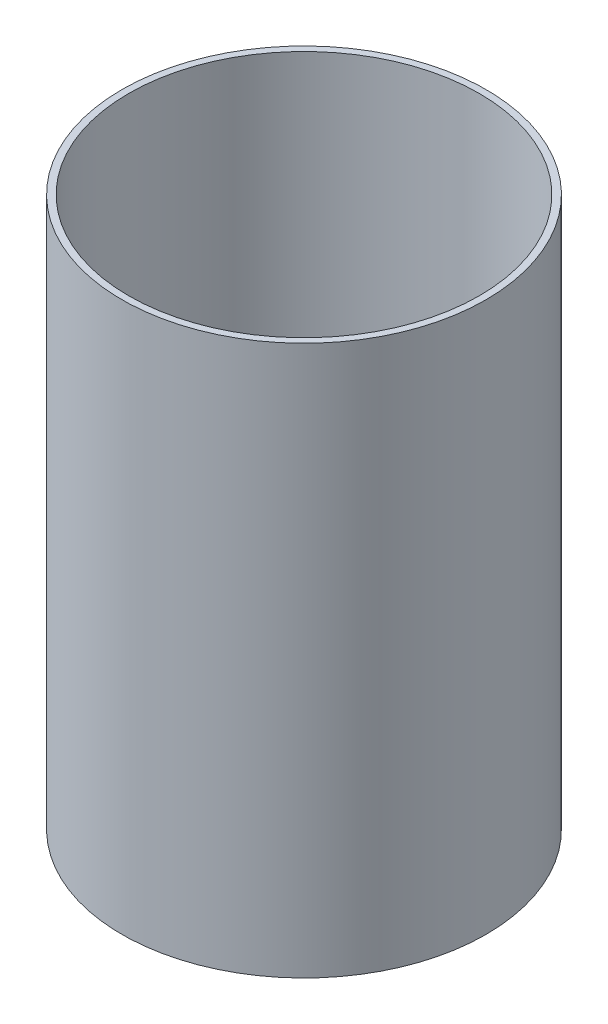
ISO-10303-21;
HEADER;
FILE_DESCRIPTION(('STEP AP214'),'2;1');
FILE_NAME('part.step','',(''),(''),'','','');
FILE_SCHEMA(('AUTOMOTIVE_DESIGN { 1 0 10303 214 1 1 1 1 }'));
ENDSEC;
DATA;
#1=APPLICATION_CONTEXT('core data for automotive mechanical design processes');
#2=APPLICATION_PROTOCOL_DEFINITION('international standard','automotive_design',2000,#1);
#3=PRODUCT_CONTEXT('',#1,'mechanical');
#4=PRODUCT('Part','Part','',(#3));
#5=PRODUCT_RELATED_PRODUCT_CATEGORY('part','',(#4));
#6=PRODUCT_DEFINITION_FORMATION('','',#4);
#7=PRODUCT_DEFINITION_CONTEXT('part definition',#1,'design');
#8=PRODUCT_DEFINITION('design','',#6,#7);
#9=PRODUCT_DEFINITION_SHAPE('','',#8);
#10=(LENGTH_UNIT() NAMED_UNIT(*) SI_UNIT(.MILLI.,.METRE.));
#11=(NAMED_UNIT(*) PLANE_ANGLE_UNIT() SI_UNIT($,.RADIAN.));
#12=(NAMED_UNIT(*) SI_UNIT($,.STERADIAN.) SOLID_ANGLE_UNIT());
#13=UNCERTAINTY_MEASURE_WITH_UNIT(LENGTH_MEASURE(1.E-05),#10,'distance_accuracy_value','');
#14=(GEOMETRIC_REPRESENTATION_CONTEXT(3) GLOBAL_UNCERTAINTY_ASSIGNED_CONTEXT((#13)) GLOBAL_UNIT_ASSIGNED_CONTEXT((#10,
#11,#12)) REPRESENTATION_CONTEXT('',''));
#15=CARTESIAN_POINT('',(0.,0.,0.));
#16=DIRECTION('',(0.,0.,1.));
#17=DIRECTION('',(1.,0.,0.));
#18=AXIS2_PLACEMENT_3D('',#15,#16,#17);
#19=CARTESIAN_POINT('',(0.,230.,0.));
#20=DIRECTION('',(0.,1.,0.));
#21=DIRECTION('',(1.,0.,0.));
#22=AXIS2_PLACEMENT_3D('',#19,#20,#21);
#23=PLANE('',#22);
#24=CARTESIAN_POINT('',(0.,230.,0.));
#25=DIRECTION('',(0.,-1.,0.));
#26=DIRECTION('',(1.,0.,0.));
#27=AXIS2_PLACEMENT_3D('',#24,#25,#26);
#28=CIRCLE('',#27,73.3425);
#29=CARTESIAN_POINT('',(-73.3425,230.,0.));
#30=VERTEX_POINT('',#29);
#31=EDGE_CURVE('E43',#30,#30,#28,.T.);
#32=ORIENTED_EDGE('',*,*,#31,.T.);
#33=EDGE_LOOP('',(#32));
#34=FACE_BOUND('',#33,.T.);
#35=CARTESIAN_POINT('',(0.,230.,0.));
#36=DIRECTION('',(0.,1.,0.));
#37=DIRECTION('',(1.,0.,0.));
#38=AXIS2_PLACEMENT_3D('',#35,#36,#37);
#39=CIRCLE('',#38,76.17);
#40=CARTESIAN_POINT('',(-76.17,230.,0.));
#41=VERTEX_POINT('',#40);
#42=EDGE_CURVE('E64',#41,#41,#39,.T.);
#43=ORIENTED_EDGE('',*,*,#42,.T.);
#44=EDGE_LOOP('',(#43));
#45=FACE_BOUND('',#44,.T.);
#46=ADVANCED_FACE('F15',(#34,#45),#23,.T.);
#47=CARTESIAN_POINT('',(0.,0.,0.));
#48=DIRECTION('',(0.,1.,0.));
#49=DIRECTION('',(1.,0.,0.));
#50=AXIS2_PLACEMENT_3D('',#47,#48,#49);
#51=PLANE('',#50);
#52=CARTESIAN_POINT('',(0.,0.,0.));
#53=DIRECTION('',(0.,1.,0.));
#54=DIRECTION('',(1.,0.,0.));
#55=AXIS2_PLACEMENT_3D('',#52,#53,#54);
#56=CIRCLE('',#55,73.3425);
#57=CARTESIAN_POINT('',(-73.3425,0.,0.));
#58=VERTEX_POINT('',#57);
#59=EDGE_CURVE('E54',#58,#58,#56,.T.);
#60=ORIENTED_EDGE('',*,*,#59,.T.);
#61=EDGE_LOOP('',(#60));
#62=FACE_BOUND('',#61,.T.);
#63=CARTESIAN_POINT('',(0.,0.,0.));
#64=DIRECTION('',(0.,-1.,0.));
#65=DIRECTION('',(1.,0.,0.));
#66=AXIS2_PLACEMENT_3D('',#63,#64,#65);
#67=CIRCLE('',#66,76.17);
#68=CARTESIAN_POINT('',(-76.17,0.,0.));
#69=VERTEX_POINT('',#68);
#70=EDGE_CURVE('E10',#69,#69,#67,.T.);
#71=ORIENTED_EDGE('',*,*,#70,.T.);
#72=EDGE_LOOP('',(#71));
#73=FACE_BOUND('',#72,.T.);
#74=ADVANCED_FACE('F57',(#62,#73),#51,.F.);
#75=CARTESIAN_POINT('',(0.,0.,0.));
#76=DIRECTION('',(0.,1.,0.));
#77=DIRECTION('',(1.,0.,0.));
#78=AXIS2_PLACEMENT_3D('',#75,#76,#77);
#79=CYLINDRICAL_SURFACE('',#78,76.17);
#80=ORIENTED_EDGE('',*,*,#42,.F.);
#81=DIRECTION('',(0.,-1.,0.));
#82=VECTOR('',#81,1.);
#83=CARTESIAN_POINT('',(-76.17,0.,0.));
#84=LINE('',#83,#82);
#85=EDGE_CURVE('E18',#41,#69,#84,.T.);
#86=ORIENTED_EDGE('',*,*,#85,.T.);
#87=ORIENTED_EDGE('',*,*,#70,.F.);
#88=ORIENTED_EDGE('',*,*,#85,.F.);
#89=EDGE_LOOP('',(#80,#86,#87,#88));
#90=FACE_BOUND('',#89,.T.);
#91=ADVANCED_FACE('F75',(#90),#79,.T.);
#92=CARTESIAN_POINT('',(0.,0.,0.));
#93=DIRECTION('',(0.,1.,0.));
#94=DIRECTION('',(1.,0.,0.));
#95=AXIS2_PLACEMENT_3D('',#92,#93,#94);
#96=CYLINDRICAL_SURFACE('',#95,73.3425);
#97=ORIENTED_EDGE('',*,*,#59,.F.);
#98=DIRECTION('',(0.,1.,0.));
#99=VECTOR('',#98,1.);
#100=CARTESIAN_POINT('',(-73.3425,0.,0.));
#101=LINE('',#100,#99);
#102=EDGE_CURVE('E51',#58,#30,#101,.T.);
#103=ORIENTED_EDGE('',*,*,#102,.T.);
#104=ORIENTED_EDGE('',*,*,#31,.F.);
#105=ORIENTED_EDGE('',*,*,#102,.F.);
#106=EDGE_LOOP('',(#97,#103,#104,#105));
#107=FACE_BOUND('',#106,.T.);
#108=ADVANCED_FACE('F53',(#107),#96,.F.);
#109=CLOSED_SHELL('',(#46,#74,#91,#108));
#110=MANIFOLD_SOLID_BREP('B1',#109);
#111=ADVANCED_BREP_SHAPE_REPRESENTATION('',(#18,#110),#14);
#112=SHAPE_DEFINITION_REPRESENTATION(#9,#111);
ENDSEC;
END-ISO-10303-21;
